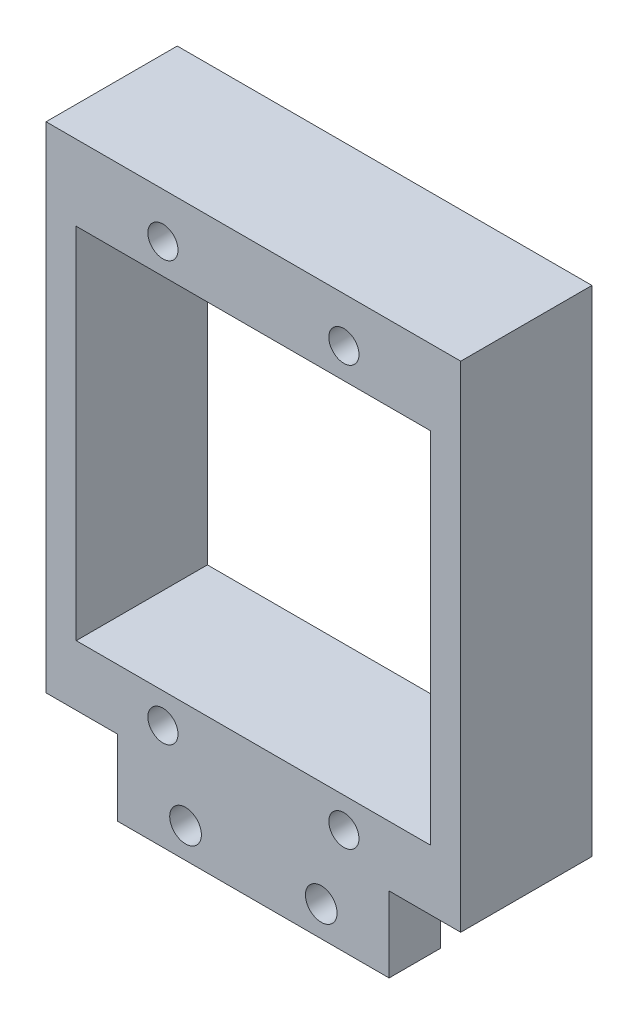
ISO-10303-21;
HEADER;
FILE_DESCRIPTION(('STEP AP214'),'2;1');
FILE_NAME('part.step','',(''),(''),'','','');
FILE_SCHEMA(('AUTOMOTIVE_DESIGN { 1 0 10303 214 1 1 1 1 }'));
ENDSEC;
DATA;
#1=APPLICATION_CONTEXT('core data for automotive mechanical design processes');
#2=APPLICATION_PROTOCOL_DEFINITION('international standard','automotive_design',2000,#1);
#3=PRODUCT_CONTEXT('',#1,'mechanical');
#4=PRODUCT('Part','Part','',(#3));
#5=PRODUCT_RELATED_PRODUCT_CATEGORY('part','',(#4));
#6=PRODUCT_DEFINITION_FORMATION('','',#4);
#7=PRODUCT_DEFINITION_CONTEXT('part definition',#1,'design');
#8=PRODUCT_DEFINITION('design','',#6,#7);
#9=PRODUCT_DEFINITION_SHAPE('','',#8);
#10=(LENGTH_UNIT() NAMED_UNIT(*) SI_UNIT(.MILLI.,.METRE.));
#11=(NAMED_UNIT(*) PLANE_ANGLE_UNIT() SI_UNIT($,.RADIAN.));
#12=(NAMED_UNIT(*) SI_UNIT($,.STERADIAN.) SOLID_ANGLE_UNIT());
#13=UNCERTAINTY_MEASURE_WITH_UNIT(LENGTH_MEASURE(1.E-05),#10,'distance_accuracy_value','');
#14=(GEOMETRIC_REPRESENTATION_CONTEXT(3) GLOBAL_UNCERTAINTY_ASSIGNED_CONTEXT((#13)) GLOBAL_UNIT_ASSIGNED_CONTEXT((#10,
#11,#12)) REPRESENTATION_CONTEXT('',''));
#15=CARTESIAN_POINT('',(0.,0.,0.));
#16=DIRECTION('',(0.,0.,1.));
#17=DIRECTION('',(1.,0.,0.));
#18=AXIS2_PLACEMENT_3D('',#15,#16,#17);
#19=CARTESIAN_POINT('',(-13.75,6.5,-5.3));
#20=DIRECTION('',(0.,1.,0.));
#21=DIRECTION('',(0.,0.,1.));
#22=AXIS2_PLACEMENT_3D('',#19,#20,#21);
#23=PLANE('',#22);
#24=DIRECTION('',(-1.,0.,0.));
#25=VECTOR('',#24,1.);
#26=CARTESIAN_POINT('',(-13.75,6.5,3.4));
#27=LINE('',#26,#25);
#28=CARTESIAN_POINT('',(11.75,6.5,3.4));
#29=VERTEX_POINT('',#28);
#30=CARTESIAN_POINT('',(-11.75,6.5,3.4));
#31=VERTEX_POINT('',#30);
#32=EDGE_CURVE('E49',#29,#31,#27,.T.);
#33=ORIENTED_EDGE('',*,*,#32,.F.);
#34=DIRECTION('',(0.,0.,1.));
#35=VECTOR('',#34,1.);
#36=CARTESIAN_POINT('',(11.75,6.5,-5.3));
#37=LINE('',#36,#35);
#38=CARTESIAN_POINT('',(11.75,6.5,-5.3));
#39=VERTEX_POINT('',#38);
#40=EDGE_CURVE('E159',#39,#29,#37,.T.);
#41=ORIENTED_EDGE('',*,*,#40,.F.);
#42=DIRECTION('',(-1.,0.,0.));
#43=VECTOR('',#42,1.);
#44=CARTESIAN_POINT('',(-13.75,6.5,-5.3));
#45=LINE('',#44,#43);
#46=CARTESIAN_POINT('',(-11.75,6.5,-5.3));
#47=VERTEX_POINT('',#46);
#48=EDGE_CURVE('E185',#39,#47,#45,.T.);
#49=ORIENTED_EDGE('',*,*,#48,.T.);
#50=DIRECTION('',(0.,0.,-1.));
#51=VECTOR('',#50,1.);
#52=CARTESIAN_POINT('',(-11.75,6.5,-5.3));
#53=LINE('',#52,#51);
#54=EDGE_CURVE('E171',#31,#47,#53,.T.);
#55=ORIENTED_EDGE('',*,*,#54,.F.);
#56=EDGE_LOOP('',(#33,#41,#49,#55));
#57=FACE_BOUND('',#56,.T.);
#58=ADVANCED_FACE('F32',(#57),#23,.T.);
#59=CARTESIAN_POINT('',(9.,-2.5,3.4));
#60=DIRECTION('',(-1.,0.,0.));
#61=DIRECTION('',(0.,0.,1.));
#62=AXIS2_PLACEMENT_3D('',#59,#60,#61);
#63=PLANE('',#62);
#64=DIRECTION('',(0.,1.,0.));
#65=VECTOR('',#64,1.);
#66=CARTESIAN_POINT('',(9.,-2.5,0.));
#67=LINE('',#66,#65);
#68=CARTESIAN_POINT('',(9.,-2.5,0.));
#69=VERTEX_POINT('',#68);
#70=CARTESIAN_POINT('',(9.,2.5,0.));
#71=VERTEX_POINT('',#70);
#72=EDGE_CURVE('E199',#69,#71,#67,.T.);
#73=ORIENTED_EDGE('',*,*,#72,.T.);
#74=DIRECTION('',(0.,0.,-1.));
#75=VECTOR('',#74,1.);
#76=CARTESIAN_POINT('',(9.,2.5,3.4));
#77=LINE('',#76,#75);
#78=CARTESIAN_POINT('',(9.,2.5,3.4));
#79=VERTEX_POINT('',#78);
#80=EDGE_CURVE('E11',#79,#71,#77,.T.);
#81=ORIENTED_EDGE('',*,*,#80,.F.);
#82=DIRECTION('',(0.,1.,0.));
#83=VECTOR('',#82,1.);
#84=CARTESIAN_POINT('',(9.,-2.5,3.4));
#85=LINE('',#84,#83);
#86=CARTESIAN_POINT('',(9.,-2.5,3.4));
#87=VERTEX_POINT('',#86);
#88=EDGE_CURVE('E201',#87,#79,#85,.T.);
#89=ORIENTED_EDGE('',*,*,#88,.F.);
#90=DIRECTION('',(0.,0.,-1.));
#91=VECTOR('',#90,1.);
#92=CARTESIAN_POINT('',(9.,-2.5,3.4));
#93=LINE('',#92,#91);
#94=EDGE_CURVE('E208',#87,#69,#93,.T.);
#95=ORIENTED_EDGE('',*,*,#94,.T.);
#96=EDGE_LOOP('',(#73,#81,#89,#95));
#97=FACE_BOUND('',#96,.T.);
#98=ADVANCED_FACE('F34',(#97),#63,.F.);
#99=CARTESIAN_POINT('',(-9.,-2.5,3.4));
#100=DIRECTION('',(1.,0.,0.));
#101=DIRECTION('',(0.,0.,-1.));
#102=AXIS2_PLACEMENT_3D('',#99,#100,#101);
#103=PLANE('',#102);
#104=DIRECTION('',(0.,-1.,0.));
#105=VECTOR('',#104,1.);
#106=CARTESIAN_POINT('',(-9.,-2.5,0.));
#107=LINE('',#106,#105);
#108=CARTESIAN_POINT('',(-9.,2.5,0.));
#109=VERTEX_POINT('',#108);
#110=CARTESIAN_POINT('',(-9.,-2.5,0.));
#111=VERTEX_POINT('',#110);
#112=EDGE_CURVE('E213',#109,#111,#107,.T.);
#113=ORIENTED_EDGE('',*,*,#112,.T.);
#114=DIRECTION('',(0.,0.,-1.));
#115=VECTOR('',#114,1.);
#116=CARTESIAN_POINT('',(-9.,-2.5,3.4));
#117=LINE('',#116,#115);
#118=CARTESIAN_POINT('',(-9.,-2.5,3.4));
#119=VERTEX_POINT('',#118);
#120=EDGE_CURVE('E218',#119,#111,#117,.T.);
#121=ORIENTED_EDGE('',*,*,#120,.F.);
#122=DIRECTION('',(0.,-1.,0.));
#123=VECTOR('',#122,1.);
#124=CARTESIAN_POINT('',(-9.,-2.5,3.4));
#125=LINE('',#124,#123);
#126=CARTESIAN_POINT('',(-9.,2.5,3.4));
#127=VERTEX_POINT('',#126);
#128=EDGE_CURVE('E203',#127,#119,#125,.T.);
#129=ORIENTED_EDGE('',*,*,#128,.F.);
#130=DIRECTION('',(0.,0.,-1.));
#131=VECTOR('',#130,1.);
#132=CARTESIAN_POINT('',(-9.,2.5,3.4));
#133=LINE('',#132,#131);
#134=EDGE_CURVE('E41',#127,#109,#133,.T.);
#135=ORIENTED_EDGE('',*,*,#134,.T.);
#136=EDGE_LOOP('',(#113,#121,#129,#135));
#137=FACE_BOUND('',#136,.T.);
#138=ADVANCED_FACE('F294',(#137),#103,.F.);
#139=CARTESIAN_POINT('',(-9.,-2.5,3.4));
#140=DIRECTION('',(0.,1.,0.));
#141=DIRECTION('',(0.,0.,1.));
#142=AXIS2_PLACEMENT_3D('',#139,#140,#141);
#143=PLANE('',#142);
#144=DIRECTION('',(1.,0.,0.));
#145=VECTOR('',#144,1.);
#146=CARTESIAN_POINT('',(-9.,-2.5,0.));
#147=LINE('',#146,#145);
#148=EDGE_CURVE('E204',#111,#69,#147,.T.);
#149=ORIENTED_EDGE('',*,*,#148,.T.);
#150=ORIENTED_EDGE('',*,*,#94,.F.);
#151=DIRECTION('',(1.,0.,0.));
#152=VECTOR('',#151,1.);
#153=CARTESIAN_POINT('',(-9.,-2.5,3.4));
#154=LINE('',#153,#152);
#155=EDGE_CURVE('E206',#119,#87,#154,.T.);
#156=ORIENTED_EDGE('',*,*,#155,.F.);
#157=ORIENTED_EDGE('',*,*,#120,.T.);
#158=EDGE_LOOP('',(#149,#150,#156,#157));
#159=FACE_BOUND('',#158,.T.);
#160=ADVANCED_FACE('F274',(#159),#143,.F.);
#161=CARTESIAN_POINT('',(0.,0.,3.4));
#162=DIRECTION('',(0.,0.,-1.));
#163=DIRECTION('',(-1.,0.,0.));
#164=AXIS2_PLACEMENT_3D('',#161,#162,#163);
#165=PLANE('',#164);
#166=CARTESIAN_POINT('',(6.,32.3,3.4));
#167=DIRECTION('',(0.,0.,1.));
#168=DIRECTION('',(-1.,0.,0.));
#169=AXIS2_PLACEMENT_3D('',#166,#167,#168);
#170=CIRCLE('',#169,1.);
#171=CARTESIAN_POINT('',(5.,32.3,3.4));
#172=VERTEX_POINT('',#171);
#173=EDGE_CURVE('E239',#172,#172,#170,.T.);
#174=ORIENTED_EDGE('',*,*,#173,.F.);
#175=EDGE_LOOP('',(#174));
#176=FACE_BOUND('',#175,.T.);
#177=CARTESIAN_POINT('',(6.,4.5,3.4));
#178=DIRECTION('',(0.,0.,1.));
#179=DIRECTION('',(1.,0.,0.));
#180=AXIS2_PLACEMENT_3D('',#177,#178,#179);
#181=CIRCLE('',#180,1.);
#182=CARTESIAN_POINT('',(7.,4.5,3.4));
#183=VERTEX_POINT('',#182);
#184=EDGE_CURVE('E246',#183,#183,#181,.T.);
#185=ORIENTED_EDGE('',*,*,#184,.F.);
#186=EDGE_LOOP('',(#185));
#187=FACE_BOUND('',#186,.T.);
#188=CARTESIAN_POINT('',(-6.,4.5,3.4));
#189=DIRECTION('',(0.,0.,1.));
#190=DIRECTION('',(1.,0.,0.));
#191=AXIS2_PLACEMENT_3D('',#188,#189,#190);
#192=CIRCLE('',#191,1.);
#193=CARTESIAN_POINT('',(-5.,4.5,3.4));
#194=VERTEX_POINT('',#193);
#195=EDGE_CURVE('E236',#194,#194,#192,.T.);
#196=ORIENTED_EDGE('',*,*,#195,.F.);
#197=EDGE_LOOP('',(#196));
#198=FACE_BOUND('',#197,.T.);
#199=CARTESIAN_POINT('',(4.5,-0.5,3.4));
#200=DIRECTION('',(0.,0.,1.));
#201=DIRECTION('',(1.,0.,0.));
#202=AXIS2_PLACEMENT_3D('',#199,#200,#201);
#203=CIRCLE('',#202,1.05);
#204=CARTESIAN_POINT('',(5.55,-0.5,3.4));
#205=VERTEX_POINT('',#204);
#206=EDGE_CURVE('E227',#205,#205,#203,.T.);
#207=ORIENTED_EDGE('',*,*,#206,.F.);
#208=EDGE_LOOP('',(#207));
#209=FACE_BOUND('',#208,.T.);
#210=CARTESIAN_POINT('',(-6.,32.3,3.4));
#211=DIRECTION('',(0.,0.,1.));
#212=DIRECTION('',(-1.,0.,0.));
#213=AXIS2_PLACEMENT_3D('',#210,#211,#212);
#214=CIRCLE('',#213,1.);
#215=CARTESIAN_POINT('',(-7.,32.3,3.4));
#216=VERTEX_POINT('',#215);
#217=EDGE_CURVE('E254',#216,#216,#214,.T.);
#218=ORIENTED_EDGE('',*,*,#217,.F.);
#219=EDGE_LOOP('',(#218));
#220=FACE_BOUND('',#219,.T.);
#221=CARTESIAN_POINT('',(-4.5,-0.5,3.4));
#222=DIRECTION('',(0.,0.,1.));
#223=DIRECTION('',(1.,0.,0.));
#224=AXIS2_PLACEMENT_3D('',#221,#222,#223);
#225=CIRCLE('',#224,1.05);
#226=CARTESIAN_POINT('',(-3.45,-0.5,3.4));
#227=VERTEX_POINT('',#226);
#228=EDGE_CURVE('E154',#227,#227,#225,.T.);
#229=ORIENTED_EDGE('',*,*,#228,.F.);
#230=EDGE_LOOP('',(#229));
#231=FACE_BOUND('',#230,.T.);
#232=DIRECTION('',(0.,-1.,0.));
#233=VECTOR('',#232,1.);
#234=CARTESIAN_POINT('',(-11.75,30.3,3.4));
#235=LINE('',#234,#233);
#236=CARTESIAN_POINT('',(-11.75,30.3,3.4));
#237=VERTEX_POINT('',#236);
#238=EDGE_CURVE('E180',#237,#31,#235,.T.);
#239=ORIENTED_EDGE('',*,*,#238,.F.);
#240=DIRECTION('',(1.,0.,0.));
#241=VECTOR('',#240,1.);
#242=CARTESIAN_POINT('',(-13.75,30.3,3.4));
#243=LINE('',#242,#241);
#244=CARTESIAN_POINT('',(11.75,30.3,3.4));
#245=VERTEX_POINT('',#244);
#246=EDGE_CURVE('E151',#237,#245,#243,.T.);
#247=ORIENTED_EDGE('',*,*,#246,.T.);
#248=DIRECTION('',(0.,-1.,0.));
#249=VECTOR('',#248,1.);
#250=CARTESIAN_POINT('',(11.75,30.3,3.4));
#251=LINE('',#250,#249);
#252=EDGE_CURVE('E165',#245,#29,#251,.T.);
#253=ORIENTED_EDGE('',*,*,#252,.T.);
#254=ORIENTED_EDGE('',*,*,#32,.T.);
#255=EDGE_LOOP('',(#239,#247,#253,#254));
#256=FACE_BOUND('',#255,.T.);
#257=ORIENTED_EDGE('',*,*,#88,.T.);
#258=DIRECTION('',(1.,0.,0.));
#259=VECTOR('',#258,1.);
#260=CARTESIAN_POINT('',(-13.75,2.5,3.4));
#261=LINE('',#260,#259);
#262=CARTESIAN_POINT('',(13.75,2.5,3.4));
#263=VERTEX_POINT('',#262);
#264=EDGE_CURVE('E132',#79,#263,#261,.T.);
#265=ORIENTED_EDGE('',*,*,#264,.T.);
#266=DIRECTION('',(0.,1.,0.));
#267=VECTOR('',#266,1.);
#268=CARTESIAN_POINT('',(13.75,6.5,3.4));
#269=LINE('',#268,#267);
#270=CARTESIAN_POINT('',(13.75,35.3,3.4));
#271=VERTEX_POINT('',#270);
#272=EDGE_CURVE('E138',#263,#271,#269,.T.);
#273=ORIENTED_EDGE('',*,*,#272,.T.);
#274=DIRECTION('',(1.,0.,0.));
#275=VECTOR('',#274,1.);
#276=CARTESIAN_POINT('',(-13.75,35.3,3.4));
#277=LINE('',#276,#275);
#278=CARTESIAN_POINT('',(-13.75,35.3,3.4));
#279=VERTEX_POINT('',#278);
#280=EDGE_CURVE('E135',#279,#271,#277,.T.);
#281=ORIENTED_EDGE('',*,*,#280,.F.);
#282=DIRECTION('',(0.,-1.,0.));
#283=VECTOR('',#282,1.);
#284=CARTESIAN_POINT('',(-13.75,6.5,3.4));
#285=LINE('',#284,#283);
#286=CARTESIAN_POINT('',(-13.75,2.5,3.4));
#287=VERTEX_POINT('',#286);
#288=EDGE_CURVE('E122',#279,#287,#285,.T.);
#289=ORIENTED_EDGE('',*,*,#288,.T.);
#290=EDGE_CURVE('E186',#287,#127,#261,.T.);
#291=ORIENTED_EDGE('',*,*,#290,.T.);
#292=ORIENTED_EDGE('',*,*,#128,.T.);
#293=ORIENTED_EDGE('',*,*,#155,.T.);
#294=EDGE_LOOP('',(#257,#265,#273,#281,#289,#291,#292,#293));
#295=FACE_BOUND('',#294,.T.);
#296=ADVANCED_FACE('F136',(#176,#187,#198,#209,#220,#231,#256,#295),#165,.F.);
#297=CARTESIAN_POINT('',(0.,0.,0.));
#298=DIRECTION('',(0.,0.,-1.));
#299=DIRECTION('',(-1.,0.,0.));
#300=AXIS2_PLACEMENT_3D('',#297,#298,#299);
#301=PLANE('',#300);
#302=CARTESIAN_POINT('',(4.5,-0.5,0.));
#303=DIRECTION('',(0.,0.,-1.));
#304=DIRECTION('',(-1.,0.,0.));
#305=AXIS2_PLACEMENT_3D('',#302,#303,#304);
#306=CIRCLE('',#305,1.05);
#307=CARTESIAN_POINT('',(3.45,-0.5,0.));
#308=VERTEX_POINT('',#307);
#309=EDGE_CURVE('E36',#308,#308,#306,.T.);
#310=ORIENTED_EDGE('',*,*,#309,.F.);
#311=EDGE_LOOP('',(#310));
#312=FACE_BOUND('',#311,.T.);
#313=CARTESIAN_POINT('',(-4.5,-0.5,0.));
#314=DIRECTION('',(0.,0.,-1.));
#315=DIRECTION('',(-1.,0.,0.));
#316=AXIS2_PLACEMENT_3D('',#313,#314,#315);
#317=CIRCLE('',#316,1.05);
#318=CARTESIAN_POINT('',(-5.55,-0.5,0.));
#319=VERTEX_POINT('',#318);
#320=EDGE_CURVE('E221',#319,#319,#317,.T.);
#321=ORIENTED_EDGE('',*,*,#320,.F.);
#322=EDGE_LOOP('',(#321));
#323=FACE_BOUND('',#322,.T.);
#324=ORIENTED_EDGE('',*,*,#72,.F.);
#325=ORIENTED_EDGE('',*,*,#148,.F.);
#326=ORIENTED_EDGE('',*,*,#112,.F.);
#327=DIRECTION('',(-1.,0.,0.));
#328=VECTOR('',#327,1.);
#329=CARTESIAN_POINT('',(-9.,2.5,0.));
#330=LINE('',#329,#328);
#331=EDGE_CURVE('E210',#71,#109,#330,.T.);
#332=ORIENTED_EDGE('',*,*,#331,.F.);
#333=EDGE_LOOP('',(#324,#325,#326,#332));
#334=FACE_BOUND('',#333,.T.);
#335=ADVANCED_FACE('F273',(#312,#323,#334),#301,.T.);
#336=CARTESIAN_POINT('',(-13.75,2.5,-5.3));
#337=DIRECTION('',(0.,-1.,0.));
#338=DIRECTION('',(0.,0.,-1.));
#339=AXIS2_PLACEMENT_3D('',#336,#337,#338);
#340=PLANE('',#339);
#341=ORIENTED_EDGE('',*,*,#134,.F.);
#342=ORIENTED_EDGE('',*,*,#290,.F.);
#343=DIRECTION('',(0.,0.,1.));
#344=VECTOR('',#343,1.);
#345=CARTESIAN_POINT('',(-13.75,2.5,-5.3));
#346=LINE('',#345,#344);
#347=CARTESIAN_POINT('',(-13.75,2.5,-5.3));
#348=VERTEX_POINT('',#347);
#349=EDGE_CURVE('E128',#348,#287,#346,.T.);
#350=ORIENTED_EDGE('',*,*,#349,.F.);
#351=DIRECTION('',(1.,0.,0.));
#352=VECTOR('',#351,1.);
#353=CARTESIAN_POINT('',(-13.75,2.5,-5.3));
#354=LINE('',#353,#352);
#355=CARTESIAN_POINT('',(13.75,2.5,-5.3));
#356=VERTEX_POINT('',#355);
#357=EDGE_CURVE('E190',#348,#356,#354,.T.);
#358=ORIENTED_EDGE('',*,*,#357,.T.);
#359=DIRECTION('',(0.,0.,1.));
#360=VECTOR('',#359,1.);
#361=CARTESIAN_POINT('',(13.75,2.5,-5.3));
#362=LINE('',#361,#360);
#363=EDGE_CURVE('E196',#356,#263,#362,.T.);
#364=ORIENTED_EDGE('',*,*,#363,.T.);
#365=ORIENTED_EDGE('',*,*,#264,.F.);
#366=ORIENTED_EDGE('',*,*,#80,.T.);
#367=ORIENTED_EDGE('',*,*,#331,.T.);
#368=EDGE_LOOP('',(#341,#342,#350,#358,#364,#365,#366,#367));
#369=FACE_BOUND('',#368,.T.);
#370=ADVANCED_FACE('F301',(#369),#340,.T.);
#371=CARTESIAN_POINT('',(13.75,6.5,-5.3));
#372=DIRECTION('',(1.,0.,0.));
#373=DIRECTION('',(0.,1.,0.));
#374=AXIS2_PLACEMENT_3D('',#371,#372,#373);
#375=PLANE('',#374);
#376=ORIENTED_EDGE('',*,*,#272,.F.);
#377=ORIENTED_EDGE('',*,*,#363,.F.);
#378=DIRECTION('',(0.,1.,0.));
#379=VECTOR('',#378,1.);
#380=CARTESIAN_POINT('',(13.75,6.5,-5.3));
#381=LINE('',#380,#379);
#382=CARTESIAN_POINT('',(13.75,35.3,-5.3));
#383=VERTEX_POINT('',#382);
#384=EDGE_CURVE('E183',#356,#383,#381,.T.);
#385=ORIENTED_EDGE('',*,*,#384,.T.);
#386=DIRECTION('',(0.,0.,-1.));
#387=VECTOR('',#386,1.);
#388=CARTESIAN_POINT('',(13.75,35.3,-5.3));
#389=LINE('',#388,#387);
#390=EDGE_CURVE('E142',#271,#383,#389,.T.);
#391=ORIENTED_EDGE('',*,*,#390,.F.);
#392=EDGE_LOOP('',(#376,#377,#385,#391));
#393=FACE_BOUND('',#392,.T.);
#394=ADVANCED_FACE('F299',(#393),#375,.T.);
#395=CARTESIAN_POINT('',(-13.75,6.5,-5.3));
#396=DIRECTION('',(-1.,0.,0.));
#397=DIRECTION('',(0.,0.,1.));
#398=AXIS2_PLACEMENT_3D('',#395,#396,#397);
#399=PLANE('',#398);
#400=ORIENTED_EDGE('',*,*,#288,.F.);
#401=DIRECTION('',(0.,0.,1.));
#402=VECTOR('',#401,1.);
#403=CARTESIAN_POINT('',(-13.75,35.3,-5.3));
#404=LINE('',#403,#402);
#405=CARTESIAN_POINT('',(-13.75,35.3,-5.3));
#406=VERTEX_POINT('',#405);
#407=EDGE_CURVE('E127',#406,#279,#404,.T.);
#408=ORIENTED_EDGE('',*,*,#407,.F.);
#409=DIRECTION('',(0.,-1.,0.));
#410=VECTOR('',#409,1.);
#411=CARTESIAN_POINT('',(-13.75,6.5,-5.3));
#412=LINE('',#411,#410);
#413=EDGE_CURVE('E188',#406,#348,#412,.T.);
#414=ORIENTED_EDGE('',*,*,#413,.T.);
#415=ORIENTED_EDGE('',*,*,#349,.T.);
#416=EDGE_LOOP('',(#400,#408,#414,#415));
#417=FACE_BOUND('',#416,.T.);
#418=ADVANCED_FACE('F124',(#417),#399,.T.);
#419=CARTESIAN_POINT('',(0.,0.,-5.3));
#420=DIRECTION('',(0.,0.,1.));
#421=DIRECTION('',(1.,0.,0.));
#422=AXIS2_PLACEMENT_3D('',#419,#420,#421);
#423=PLANE('',#422);
#424=CARTESIAN_POINT('',(6.,32.3,-5.3));
#425=DIRECTION('',(0.,0.,1.));
#426=DIRECTION('',(-1.,0.,0.));
#427=AXIS2_PLACEMENT_3D('',#424,#425,#426);
#428=CIRCLE('',#427,1.);
#429=CARTESIAN_POINT('',(5.,32.3,-5.3));
#430=VERTEX_POINT('',#429);
#431=EDGE_CURVE('E251',#430,#430,#428,.T.);
#432=ORIENTED_EDGE('',*,*,#431,.T.);
#433=EDGE_LOOP('',(#432));
#434=FACE_BOUND('',#433,.T.);
#435=CARTESIAN_POINT('',(6.,4.5,-5.3));
#436=DIRECTION('',(0.,0.,1.));
#437=DIRECTION('',(1.,0.,0.));
#438=AXIS2_PLACEMENT_3D('',#435,#436,#437);
#439=CIRCLE('',#438,1.);
#440=CARTESIAN_POINT('',(7.,4.5,-5.3));
#441=VERTEX_POINT('',#440);
#442=EDGE_CURVE('E242',#441,#441,#439,.T.);
#443=ORIENTED_EDGE('',*,*,#442,.T.);
#444=EDGE_LOOP('',(#443));
#445=FACE_BOUND('',#444,.T.);
#446=CARTESIAN_POINT('',(-6.,4.5,-5.3));
#447=DIRECTION('',(0.,0.,1.));
#448=DIRECTION('',(1.,0.,0.));
#449=AXIS2_PLACEMENT_3D('',#446,#447,#448);
#450=CIRCLE('',#449,1.);
#451=CARTESIAN_POINT('',(-5.,4.5,-5.3));
#452=VERTEX_POINT('',#451);
#453=EDGE_CURVE('E231',#452,#452,#450,.T.);
#454=ORIENTED_EDGE('',*,*,#453,.T.);
#455=EDGE_LOOP('',(#454));
#456=FACE_BOUND('',#455,.T.);
#457=CARTESIAN_POINT('',(-6.,32.3,-5.3));
#458=DIRECTION('',(0.,0.,1.));
#459=DIRECTION('',(-1.,0.,0.));
#460=AXIS2_PLACEMENT_3D('',#457,#458,#459);
#461=CIRCLE('',#460,1.);
#462=CARTESIAN_POINT('',(-7.,32.3,-5.3));
#463=VERTEX_POINT('',#462);
#464=EDGE_CURVE('E260',#463,#463,#461,.T.);
#465=ORIENTED_EDGE('',*,*,#464,.T.);
#466=EDGE_LOOP('',(#465));
#467=FACE_BOUND('',#466,.T.);
#468=ORIENTED_EDGE('',*,*,#413,.F.);
#469=DIRECTION('',(-1.,0.,0.));
#470=VECTOR('',#469,1.);
#471=CARTESIAN_POINT('',(-13.75,35.3,-5.3));
#472=LINE('',#471,#470);
#473=EDGE_CURVE('E147',#383,#406,#472,.T.);
#474=ORIENTED_EDGE('',*,*,#473,.F.);
#475=ORIENTED_EDGE('',*,*,#384,.F.);
#476=ORIENTED_EDGE('',*,*,#357,.F.);
#477=EDGE_LOOP('',(#468,#474,#475,#476));
#478=FACE_BOUND('',#477,.T.);
#479=DIRECTION('',(-1.,0.,0.));
#480=VECTOR('',#479,1.);
#481=CARTESIAN_POINT('',(-13.75,30.3,-5.3));
#482=LINE('',#481,#480);
#483=CARTESIAN_POINT('',(11.75,30.3,-5.3));
#484=VERTEX_POINT('',#483);
#485=CARTESIAN_POINT('',(-11.75,30.3,-5.3));
#486=VERTEX_POINT('',#485);
#487=EDGE_CURVE('E148',#484,#486,#482,.T.);
#488=ORIENTED_EDGE('',*,*,#487,.T.);
#489=DIRECTION('',(0.,-1.,0.));
#490=VECTOR('',#489,1.);
#491=CARTESIAN_POINT('',(-11.75,30.3,-5.3));
#492=LINE('',#491,#490);
#493=EDGE_CURVE('E175',#486,#47,#492,.T.);
#494=ORIENTED_EDGE('',*,*,#493,.T.);
#495=ORIENTED_EDGE('',*,*,#48,.F.);
#496=DIRECTION('',(0.,-1.,0.));
#497=VECTOR('',#496,1.);
#498=CARTESIAN_POINT('',(11.75,30.3,-5.3));
#499=LINE('',#498,#497);
#500=EDGE_CURVE('E168',#484,#39,#499,.T.);
#501=ORIENTED_EDGE('',*,*,#500,.F.);
#502=EDGE_LOOP('',(#488,#494,#495,#501));
#503=FACE_BOUND('',#502,.T.);
#504=ADVANCED_FACE('F288',(#434,#445,#456,#467,#478,#503),#423,.F.);
#505=CARTESIAN_POINT('',(-11.75,30.3,-5.3));
#506=DIRECTION('',(-1.,0.,0.));
#507=DIRECTION('',(0.,0.,1.));
#508=AXIS2_PLACEMENT_3D('',#505,#506,#507);
#509=PLANE('',#508);
#510=ORIENTED_EDGE('',*,*,#54,.T.);
#511=ORIENTED_EDGE('',*,*,#493,.F.);
#512=DIRECTION('',(0.,0.,-1.));
#513=VECTOR('',#512,1.);
#514=CARTESIAN_POINT('',(-11.75,30.3,-5.3));
#515=LINE('',#514,#513);
#516=EDGE_CURVE('E172',#237,#486,#515,.T.);
#517=ORIENTED_EDGE('',*,*,#516,.F.);
#518=ORIENTED_EDGE('',*,*,#238,.T.);
#519=EDGE_LOOP('',(#510,#511,#517,#518));
#520=FACE_BOUND('',#519,.T.);
#521=ADVANCED_FACE('F280',(#520),#509,.F.);
#522=CARTESIAN_POINT('',(11.75,30.3,-5.3));
#523=DIRECTION('',(1.,0.,0.));
#524=DIRECTION('',(0.,0.,-1.));
#525=AXIS2_PLACEMENT_3D('',#522,#523,#524);
#526=PLANE('',#525);
#527=ORIENTED_EDGE('',*,*,#40,.T.);
#528=ORIENTED_EDGE('',*,*,#252,.F.);
#529=DIRECTION('',(0.,0.,1.));
#530=VECTOR('',#529,1.);
#531=CARTESIAN_POINT('',(11.75,30.3,-5.3));
#532=LINE('',#531,#530);
#533=EDGE_CURVE('E162',#484,#245,#532,.T.);
#534=ORIENTED_EDGE('',*,*,#533,.F.);
#535=ORIENTED_EDGE('',*,*,#500,.T.);
#536=EDGE_LOOP('',(#527,#528,#534,#535));
#537=FACE_BOUND('',#536,.T.);
#538=ADVANCED_FACE('F286',(#537),#526,.F.);
#539=CARTESIAN_POINT('',(0.,30.3,0.));
#540=DIRECTION('',(0.,1.,0.));
#541=DIRECTION('',(0.,0.,1.));
#542=AXIS2_PLACEMENT_3D('',#539,#540,#541);
#543=PLANE('',#542);
#544=ORIENTED_EDGE('',*,*,#246,.F.);
#545=ORIENTED_EDGE('',*,*,#516,.T.);
#546=ORIENTED_EDGE('',*,*,#487,.F.);
#547=ORIENTED_EDGE('',*,*,#533,.T.);
#548=EDGE_LOOP('',(#544,#545,#546,#547));
#549=FACE_BOUND('',#548,.T.);
#550=ADVANCED_FACE('F283',(#549),#543,.F.);
#551=CARTESIAN_POINT('',(0.,35.3,0.));
#552=DIRECTION('',(0.,1.,0.));
#553=DIRECTION('',(0.,0.,1.));
#554=AXIS2_PLACEMENT_3D('',#551,#552,#553);
#555=PLANE('',#554);
#556=ORIENTED_EDGE('',*,*,#407,.T.);
#557=ORIENTED_EDGE('',*,*,#280,.T.);
#558=ORIENTED_EDGE('',*,*,#390,.T.);
#559=ORIENTED_EDGE('',*,*,#473,.T.);
#560=EDGE_LOOP('',(#556,#557,#558,#559));
#561=FACE_BOUND('',#560,.T.);
#562=ADVANCED_FACE('F145',(#561),#555,.T.);
#563=CARTESIAN_POINT('',(-6.,32.3,-5.3));
#564=DIRECTION('',(0.,0.,1.));
#565=DIRECTION('',(1.,0.,0.));
#566=AXIS2_PLACEMENT_3D('',#563,#564,#565);
#567=CYLINDRICAL_SURFACE('',#566,1.);
#568=ORIENTED_EDGE('',*,*,#464,.F.);
#569=EDGE_LOOP('',(#568));
#570=FACE_BOUND('',#569,.T.);
#571=ORIENTED_EDGE('',*,*,#217,.T.);
#572=EDGE_LOOP('',(#571));
#573=FACE_BOUND('',#572,.T.);
#574=ADVANCED_FACE('F269',(#570,#573),#567,.F.);
#575=CARTESIAN_POINT('',(-6.,4.5,-5.3));
#576=DIRECTION('',(0.,0.,1.));
#577=DIRECTION('',(1.,0.,0.));
#578=AXIS2_PLACEMENT_3D('',#575,#576,#577);
#579=CYLINDRICAL_SURFACE('',#578,1.);
#580=ORIENTED_EDGE('',*,*,#453,.F.);
#581=EDGE_LOOP('',(#580));
#582=FACE_BOUND('',#581,.T.);
#583=ORIENTED_EDGE('',*,*,#195,.T.);
#584=EDGE_LOOP('',(#583));
#585=FACE_BOUND('',#584,.T.);
#586=ADVANCED_FACE('F407',(#582,#585),#579,.F.);
#587=CARTESIAN_POINT('',(6.,4.5,-5.3));
#588=DIRECTION('',(0.,0.,1.));
#589=DIRECTION('',(1.,0.,0.));
#590=AXIS2_PLACEMENT_3D('',#587,#588,#589);
#591=CYLINDRICAL_SURFACE('',#590,1.);
#592=ORIENTED_EDGE('',*,*,#442,.F.);
#593=EDGE_LOOP('',(#592));
#594=FACE_BOUND('',#593,.T.);
#595=ORIENTED_EDGE('',*,*,#184,.T.);
#596=EDGE_LOOP('',(#595));
#597=FACE_BOUND('',#596,.T.);
#598=ADVANCED_FACE('F417',(#594,#597),#591,.F.);
#599=CARTESIAN_POINT('',(6.,32.3,-5.3));
#600=DIRECTION('',(0.,0.,1.));
#601=DIRECTION('',(1.,0.,0.));
#602=AXIS2_PLACEMENT_3D('',#599,#600,#601);
#603=CYLINDRICAL_SURFACE('',#602,1.);
#604=ORIENTED_EDGE('',*,*,#431,.F.);
#605=EDGE_LOOP('',(#604));
#606=FACE_BOUND('',#605,.T.);
#607=ORIENTED_EDGE('',*,*,#173,.T.);
#608=EDGE_LOOP('',(#607));
#609=FACE_BOUND('',#608,.T.);
#610=ADVANCED_FACE('F427',(#606,#609),#603,.F.);
#611=CARTESIAN_POINT('',(-4.5,-0.5,-5.3));
#612=DIRECTION('',(0.,0.,1.));
#613=DIRECTION('',(1.,0.,0.));
#614=AXIS2_PLACEMENT_3D('',#611,#612,#613);
#615=CYLINDRICAL_SURFACE('',#614,1.05);
#616=ORIENTED_EDGE('',*,*,#320,.T.);
#617=EDGE_LOOP('',(#616));
#618=FACE_BOUND('',#617,.T.);
#619=ORIENTED_EDGE('',*,*,#228,.T.);
#620=EDGE_LOOP('',(#619));
#621=FACE_BOUND('',#620,.T.);
#622=ADVANCED_FACE('F437',(#618,#621),#615,.F.);
#623=CARTESIAN_POINT('',(4.5,-0.5,-5.3));
#624=DIRECTION('',(0.,0.,1.));
#625=DIRECTION('',(1.,0.,0.));
#626=AXIS2_PLACEMENT_3D('',#623,#624,#625);
#627=CYLINDRICAL_SURFACE('',#626,1.05);
#628=ORIENTED_EDGE('',*,*,#309,.T.);
#629=EDGE_LOOP('',(#628));
#630=FACE_BOUND('',#629,.T.);
#631=ORIENTED_EDGE('',*,*,#206,.T.);
#632=EDGE_LOOP('',(#631));
#633=FACE_BOUND('',#632,.T.);
#634=ADVANCED_FACE('F447',(#630,#633),#627,.F.);
#635=CLOSED_SHELL('',(#58,#98,#138,#160,#296,#335,#370,#394,#418,#504,#521,#538,#550,#562,#574,
#586,#598,#610,#622,#634));
#636=MANIFOLD_SOLID_BREP('B2',#635);
#637=ADVANCED_BREP_SHAPE_REPRESENTATION('',(#18,#636),#14);
#638=SHAPE_DEFINITION_REPRESENTATION(#9,#637);
ENDSEC;
END-ISO-10303-21;
